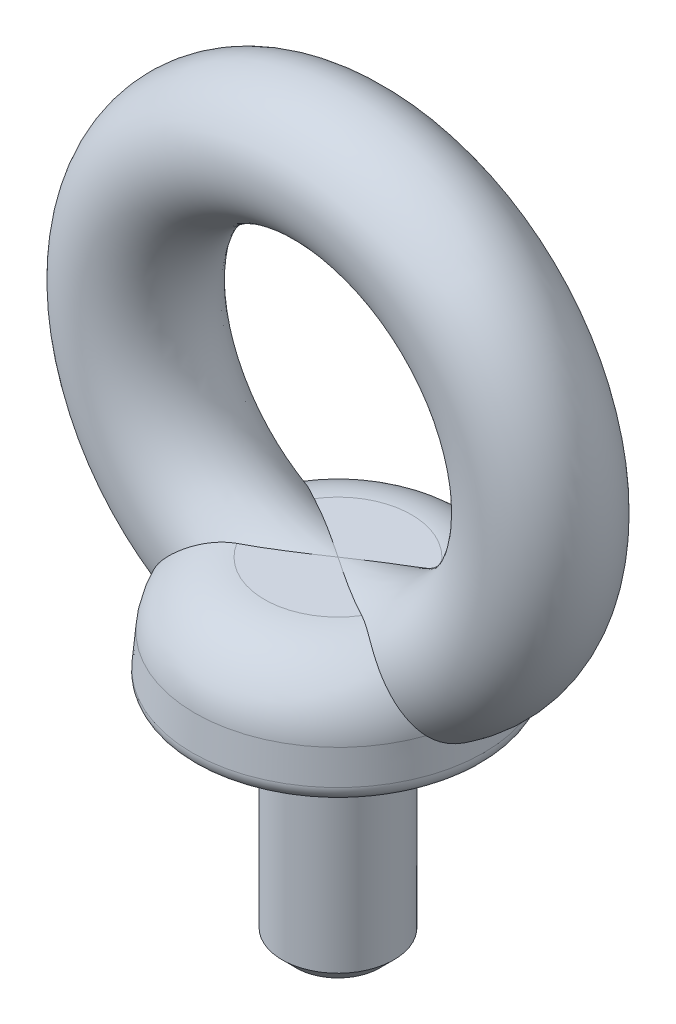
ISO-10303-21;
HEADER;
FILE_DESCRIPTION(('STEP AP214'),'2;1');
FILE_NAME('part.step','',(''),(''),'','','');
FILE_SCHEMA(('AUTOMOTIVE_DESIGN { 1 0 10303 214 1 1 1 1 }'));
ENDSEC;
DATA;
#1=APPLICATION_CONTEXT('core data for automotive mechanical design processes');
#2=APPLICATION_PROTOCOL_DEFINITION('international standard','automotive_design',2000,#1);
#3=PRODUCT_CONTEXT('',#1,'mechanical');
#4=PRODUCT('Part','Part','',(#3));
#5=PRODUCT_RELATED_PRODUCT_CATEGORY('part','',(#4));
#6=PRODUCT_DEFINITION_FORMATION('','',#4);
#7=PRODUCT_DEFINITION_CONTEXT('part definition',#1,'design');
#8=PRODUCT_DEFINITION('design','',#6,#7);
#9=PRODUCT_DEFINITION_SHAPE('','',#8);
#10=(LENGTH_UNIT() NAMED_UNIT(*) SI_UNIT(.MILLI.,.METRE.));
#11=(NAMED_UNIT(*) PLANE_ANGLE_UNIT() SI_UNIT($,.RADIAN.));
#12=(NAMED_UNIT(*) SI_UNIT($,.STERADIAN.) SOLID_ANGLE_UNIT());
#13=UNCERTAINTY_MEASURE_WITH_UNIT(LENGTH_MEASURE(1.E-05),#10,'distance_accuracy_value','');
#14=(GEOMETRIC_REPRESENTATION_CONTEXT(3) GLOBAL_UNCERTAINTY_ASSIGNED_CONTEXT((#13)) GLOBAL_UNIT_ASSIGNED_CONTEXT((#10,
#11,#12)) REPRESENTATION_CONTEXT('',''));
#15=CARTESIAN_POINT('',(0.,0.,0.));
#16=DIRECTION('',(0.,0.,1.));
#17=DIRECTION('',(1.,0.,0.));
#18=AXIS2_PLACEMENT_3D('',#15,#16,#17);
#19=CARTESIAN_POINT('',(0.,0.,0.));
#20=DIRECTION('',(0.,1.,0.));
#21=DIRECTION('',(0.,0.,1.));
#22=AXIS2_PLACEMENT_3D('',#19,#20,#21);
#23=PLANE('',#22);
#24=CARTESIAN_POINT('',(0.,0.,0.));
#25=DIRECTION('',(0.,1.,0.));
#26=DIRECTION('',(0.,0.,1.));
#27=AXIS2_PLACEMENT_3D('',#24,#25,#26);
#28=CIRCLE('',#27,2.36467287473268);
#29=CARTESIAN_POINT('',(0.,0.,2.36467287473268));
#30=VERTEX_POINT('',#29);
#31=EDGE_CURVE('E188',#30,#30,#28,.F.);
#32=ORIENTED_EDGE('',*,*,#31,.T.);
#33=EDGE_LOOP('',(#32));
#34=FACE_BOUND('',#33,.T.);
#35=CARTESIAN_POINT('',(0.,0.,0.));
#36=DIRECTION('',(0.,1.,0.));
#37=DIRECTION('',(0.,0.,1.));
#38=AXIS2_PLACEMENT_3D('',#35,#36,#37);
#39=CIRCLE('',#38,1.);
#40=CARTESIAN_POINT('',(0.,0.,1.));
#41=VERTEX_POINT('',#40);
#42=EDGE_CURVE('E191',#41,#41,#39,.T.);
#43=ORIENTED_EDGE('',*,*,#42,.T.);
#44=EDGE_LOOP('',(#43));
#45=FACE_BOUND('',#44,.T.);
#46=ADVANCED_FACE('F39',(#34,#45),#23,.F.);
#47=CARTESIAN_POINT('',(0.,2.,0.));
#48=DIRECTION('',(0.,1.,0.));
#49=DIRECTION('',(0.,0.,1.));
#50=AXIS2_PLACEMENT_3D('',#47,#48,#49);
#51=PLANE('',#50);
#52=CARTESIAN_POINT('',(0.,2.,0.));
#53=CARTESIAN_POINT('',(-0.00138409122770579,2.,-0.000928476146925711));
#54=CARTESIAN_POINT('',(-0.0027681825606933,2.,-0.00185695284612975));
#55=CARTESIAN_POINT('',(-0.162615317010321,2.00000000000003,-0.10908536698182));
#56=CARTESIAN_POINT('',(-0.321098427042225,2.00000000000001,-0.215364236272865));
#57=CARTESIAN_POINT('',(-0.642556318670196,1.99999999999999,-0.421508242799578));
#58=CARTESIAN_POINT('',(-0.805535735588401,2.,-0.52136637857884));
#59=CARTESIAN_POINT('',(-1.13738109759114,2.,-0.705971695960755));
#60=CARTESIAN_POINT('',(-1.30614701866206,2.,-0.790893395826265));
#61=CARTESIAN_POINT('',(-1.65313868543101,2.,-0.938041353631445));
#62=CARTESIAN_POINT('',(-1.83132829037376,2.,-1.00034800389567));
#63=CARTESIAN_POINT('',(-2.13036137927402,2.,-1.07473182884484));
#64=CARTESIAN_POINT('',(-2.24862768187056,2.,-1.09682614354295));
#65=CARTESIAN_POINT('',(-2.42857338989204,2.,-1.11707090413544));
#66=CARTESIAN_POINT('',(-2.48953666427238,2.,-1.12165083664664));
#67=CARTESIAN_POINT('',(-2.61172683939246,2.,-1.12580496779447));
#68=CARTESIAN_POINT('',(-2.6729540085122,2.,-1.12537094474276));
#69=CARTESIAN_POINT('',(-2.7340934574525,2.,-1.1221688392154));
#70=B_SPLINE_CURVE_WITH_KNOTS('',3,(#52,#53,#54,#55,#56,#57,#58,#59,#60,#61,#62,#63,#64,#65,#66,
#67,#68,#69),.UNSPECIFIED.,.F.,.F.,(4,2,2,2,2,2,2,2,4),(0.,0.00500000000000066,
0.577443676661357,1.15050134060949,1.71633967382284,2.28014638692955,2.6399668541472,
2.82318474846742,3.00670311891554),.UNSPECIFIED.);
#71=CARTESIAN_POINT('',(0.,2.,0.));
#72=VERTEX_POINT('',#71);
#73=CARTESIAN_POINT('',(-1.11966575300488,2.,-0.693630985076324));
#74=VERTEX_POINT('',#73);
#75=EDGE_CURVE('E54',#72,#74,#70,.T.);
#76=ORIENTED_EDGE('',*,*,#75,.F.);
#77=CARTESIAN_POINT('',(0.,2.,0.));
#78=CARTESIAN_POINT('',(0.00138409122770579,2.,-0.000928476146925711));
#79=CARTESIAN_POINT('',(0.0027681825606933,2.,-0.00185695284612975));
#80=CARTESIAN_POINT('',(0.162615317010321,2.00000000000003,-0.10908536698182));
#81=CARTESIAN_POINT('',(0.321098427042225,2.00000000000001,-0.215364236272865));
#82=CARTESIAN_POINT('',(0.642556318670196,1.99999999999999,-0.421508242799578));
#83=CARTESIAN_POINT('',(0.805535735588401,2.,-0.52136637857884));
#84=CARTESIAN_POINT('',(1.13738109759114,2.,-0.705971695960755));
#85=CARTESIAN_POINT('',(1.30614701866206,2.,-0.790893395826265));
#86=CARTESIAN_POINT('',(1.65313868543101,2.,-0.938041353631445));
#87=CARTESIAN_POINT('',(1.83132829037376,2.,-1.00034800389567));
#88=CARTESIAN_POINT('',(2.13036137927402,2.,-1.07473182884484));
#89=CARTESIAN_POINT('',(2.24862768187056,2.,-1.09682614354295));
#90=CARTESIAN_POINT('',(2.42857338989204,2.,-1.11707090413544));
#91=CARTESIAN_POINT('',(2.48953666427238,2.,-1.12165083664664));
#92=CARTESIAN_POINT('',(2.61172683939246,2.,-1.12580496779447));
#93=CARTESIAN_POINT('',(2.6729540085122,2.,-1.12537094474276));
#94=CARTESIAN_POINT('',(2.7340934574525,2.,-1.1221688392154));
#95=B_SPLINE_CURVE_WITH_KNOTS('',3,(#77,#78,#79,#80,#81,#82,#83,#84,#85,#86,#87,#88,#89,#90,#91,
#92,#93,#94),.UNSPECIFIED.,.F.,.F.,(4,2,2,2,2,2,2,2,4),(0.,0.00500000000000066,
0.577443676661357,1.15050134060949,1.71633967382284,2.28014638692955,2.6399668541472,
2.82318474846742,3.00670311891554),.UNSPECIFIED.);
#96=CARTESIAN_POINT('',(1.11966575300489,2.,-0.693630985076301));
#97=VERTEX_POINT('',#96);
#98=EDGE_CURVE('E102',#97,#72,#95,.F.);
#99=ORIENTED_EDGE('',*,*,#98,.F.);
#100=CARTESIAN_POINT('',(0.,2.,0.));
#101=DIRECTION('',(0.,1.,0.));
#102=DIRECTION('',(0.,0.,1.));
#103=AXIS2_PLACEMENT_3D('',#100,#101,#102);
#104=CIRCLE('',#103,1.31710870542637);
#105=EDGE_CURVE('E318',#97,#74,#104,.T.);
#106=ORIENTED_EDGE('',*,*,#105,.T.);
#107=EDGE_LOOP('',(#76,#99,#106));
#108=FACE_BOUND('',#107,.T.);
#109=ADVANCED_FACE('F180',(#108),#51,.T.);
#110=CARTESIAN_POINT('',(0.,0.75,0.));
#111=DIRECTION('',(0.,1.,0.));
#112=DIRECTION('',(0.,0.,1.));
#113=AXIS2_PLACEMENT_3D('',#110,#111,#112);
#114=TOROIDAL_SURFACE('',#113,1.31710870542637,1.25);
#115=CARTESIAN_POINT('',(2.42039796914941,0.858894678434573,-0.841037606347116));
#116=CARTESIAN_POINT('',(2.41150547808007,0.879981984721991,-0.861011370284895));
#117=CARTESIAN_POINT('',(2.40200403891799,0.901642037124406,-0.880090939790039));
#118=CARTESIAN_POINT('',(2.38174136886284,0.945944322718926,-0.916357850156611));
#119=CARTESIAN_POINT('',(2.37097983503115,0.968586791266183,-0.933544734063541));
#120=CARTESIAN_POINT('',(2.33673266722838,1.0377601523188,-0.982119959579194));
#121=CARTESIAN_POINT('',(2.31129713982183,1.08550619080916,-1.01049383691973));
#122=CARTESIAN_POINT('',(2.25525140209412,1.18255505391846,-1.05830108235167));
#123=CARTESIAN_POINT('',(2.22463086526007,1.23186082235517,-1.07771631511264));
#124=CARTESIAN_POINT('',(2.15860473404437,1.33006497499959,-1.10687997831171));
#125=CARTESIAN_POINT('',(2.12320511505156,1.37896378824822,-1.11664035551223));
#126=CARTESIAN_POINT('',(2.04970080845279,1.47256424566783,-1.12608467484591));
#127=CARTESIAN_POINT('',(2.01175922447572,1.51735544391369,-1.12615313231805));
#128=CARTESIAN_POINT('',(1.93271591031358,1.60313949237734,-1.11742114519198));
#129=CARTESIAN_POINT('',(1.89161352963342,1.64413155688122,-1.10861887045206));
#130=CARTESIAN_POINT('',(1.8079643196868,1.71994439074484,-1.08321423460844));
#131=CARTESIAN_POINT('',(1.76546789486288,1.75487937256813,-1.06678453233506));
#132=CARTESIAN_POINT('',(1.67887427645391,1.81848931902083,-1.02746329945967));
#133=CARTESIAN_POINT('',(1.63477767290606,1.84716656426527,-1.00457412999074));
#134=CARTESIAN_POINT('',(1.54264253220054,1.89902087157686,-0.952520238273537));
#135=CARTESIAN_POINT('',(1.49452684988591,1.92176061115668,-0.923059783325188));
#136=CARTESIAN_POINT('',(1.3967286641391,1.95885359907775,-0.861312588732647));
#137=CARTESIAN_POINT('',(1.34704241240058,1.97318488989702,-0.829018700239076));
#138=CARTESIAN_POINT('',(1.25075798911749,1.99206720619931,-0.76838493020841));
#139=CARTESIAN_POINT('',(1.20436882183495,1.99747351542922,-0.739980374857328));
#140=CARTESIAN_POINT('',(1.10929155781928,2.00110585166331,-0.687307941097035));
#141=CARTESIAN_POINT('',(1.06062099431507,1.99937986063686,-0.663013560335142));
#142=CARTESIAN_POINT('',(0.968596883629371,1.99001955811812,-0.626098684318004));
#143=CARTESIAN_POINT('',(0.925664935838794,1.98339117664191,-0.612222559613753));
#144=CARTESIAN_POINT('',(0.86039016732774,1.97071539983241,-0.59711669625961));
#145=CARTESIAN_POINT('',(0.838411430092534,1.96601442968154,-0.593028833236067));
#146=CARTESIAN_POINT('',(0.794366125123625,1.95593080847073,-0.586725364893368));
#147=CARTESIAN_POINT('',(0.772299661153692,1.95054881185459,-0.58450797758792));
#148=CARTESIAN_POINT('',(0.719154501602297,1.93704091889652,-0.58118935598795));
#149=CARTESIAN_POINT('',(0.688083723835251,1.92869355431696,-0.580916404100505));
#150=CARTESIAN_POINT('',(0.626076861097626,1.9117293086771,-0.582788802681816));
#151=CARTESIAN_POINT('',(0.595141017505899,1.90311207569429,-0.584937450578257));
#152=CARTESIAN_POINT('',(0.533144324526091,1.88608734843549,-0.590675490691851));
#153=CARTESIAN_POINT('',(0.502083928174988,1.8776815327694,-0.59427394189973));
#154=CARTESIAN_POINT('',(0.439861378293333,1.86159673569978,-0.60202559071365));
#155=CARTESIAN_POINT('',(0.408699278636015,1.85391741901609,-0.606178530267754));
#156=CARTESIAN_POINT('',(0.346471938992451,1.83978801638737,-0.614271855394327));
#157=CARTESIAN_POINT('',(0.315410196641867,1.83332401240693,-0.618214222865114));
#158=CARTESIAN_POINT('',(0.252933286434531,1.8218954905164,-0.625389345239395));
#159=CARTESIAN_POINT('',(0.221518253780048,1.81693041795681,-0.628622362502412));
#160=CARTESIAN_POINT('',(0.158548314164443,1.80885956460285,-0.633949322318588));
#161=CARTESIAN_POINT('',(0.12699554347192,1.80574223986466,-0.636050329515921));
#162=CARTESIAN_POINT('',(0.0636919061812754,1.80155463382932,-0.63888353697977));
#163=CARTESIAN_POINT('',(0.0319410693356876,1.80048405217148,-0.639615938089639));
#164=CARTESIAN_POINT('',(-0.0307178516850954,1.80047546423124,-0.639621782100821));
#165=CARTESIAN_POINT('',(-0.0616259454764916,1.80148163159415,-0.638933417481909));
#166=CARTESIAN_POINT('',(-0.123259668362024,1.80543711629179,-0.6362563278));
#167=CARTESIAN_POINT('',(-0.153985276893146,1.80838664857117,-0.634267458895744));
#168=CARTESIAN_POINT('',(-0.215301950880578,1.81603914162037,-0.629205449850562));
#169=CARTESIAN_POINT('',(-0.245891175127802,1.82075226813661,-0.626126029151428));
#170=CARTESIAN_POINT('',(-0.306737126087516,1.83162541649934,-0.619266566540589));
#171=CARTESIAN_POINT('',(-0.33699373759345,1.83778592410954,-0.61548628950057));
#172=CARTESIAN_POINT('',(-0.428204898309679,1.8581083189365,-0.603667142824017));
#173=CARTESIAN_POINT('',(-0.48870198982746,1.87397933951536,-0.595249863543692));
#174=CARTESIAN_POINT('',(-0.609630407138156,1.90701613658001,-0.58324566142176));
#175=CARTESIAN_POINT('',(-0.670059841651902,1.92417333338502,-0.579629297436111));
#176=CARTESIAN_POINT('',(-0.774142499657668,1.95119852576556,-0.583912273461106));
#177=CARTESIAN_POINT('',(-0.81766645960905,1.96175005385817,-0.588822252272903));
#178=CARTESIAN_POINT('',(-0.903612265037172,1.97950121179433,-0.606177451139279));
#179=CARTESIAN_POINT('',(-0.946039542332458,1.98672283462284,-0.618571943538506));
#180=CARTESIAN_POINT('',(-1.02892867288492,1.99672112208587,-0.649422404719276));
#181=CARTESIAN_POINT('',(-1.06939684890633,1.99951315956102,-0.667857140871685));
#182=CARTESIAN_POINT('',(-1.14871437226766,2.00037343312812,-0.708435636176288));
#183=CARTESIAN_POINT('',(-1.18755255309529,1.99841323339055,-0.730600980323087));
#184=CARTESIAN_POINT('',(-1.25542737944985,1.99067281071267,-0.771376997109682));
#185=CARTESIAN_POINT('',(-1.28474930196113,1.98582223840216,-0.789704316301775));
#186=CARTESIAN_POINT('',(-1.34271384957444,1.97325106497408,-0.8264563551847));
#187=CARTESIAN_POINT('',(-1.37135621169787,1.96552937144779,-0.844881109313995));
#188=CARTESIAN_POINT('',(-1.45642105854802,1.93814049749805,-0.899221931174776));
#189=CARTESIAN_POINT('',(-1.51210059844485,1.91423545207616,-0.934282834596374));
#190=CARTESIAN_POINT('',(-1.62188928203517,1.85571081470426,-0.99793326709202));
#191=CARTESIAN_POINT('',(-1.67599135292653,1.8210492680532,-1.02649668385246));
#192=CARTESIAN_POINT('',(-1.78173215288799,1.74243068059502,-1.07378186603908));
#193=CARTESIAN_POINT('',(-1.83337249856053,1.69847984601635,-1.09251017339328));
#194=CARTESIAN_POINT('',(-1.92671099911643,1.60945259035115,-1.1163970370076));
#195=CARTESIAN_POINT('',(-1.96884479421639,1.565204631705,-1.12295993942017));
#196=CARTESIAN_POINT('',(-2.04938632154604,1.47312235238822,-1.1262243095909));
#197=CARTESIAN_POINT('',(-2.08779594195042,1.42528987112897,-1.1229308018743));
#198=CARTESIAN_POINT('',(-2.15776889516972,1.33117782285486,-1.10694709307882));
#199=CARTESIAN_POINT('',(-2.18961508486601,1.2849997337084,-1.09488227622439));
#200=CARTESIAN_POINT('',(-2.24898462403084,1.192772743093,-1.06239164711726));
#201=CARTESIAN_POINT('',(-2.27650557337996,1.14672392718032,-1.04196121521108));
#202=CARTESIAN_POINT('',(-2.32557145608986,1.05880834073601,-0.994687257760194));
#203=CARTESIAN_POINT('',(-2.34736379327855,1.01685147129592,-0.968264097530917));
#204=CARTESIAN_POINT('',(-2.3868931810764,0.935609849491477,-0.909172956923643));
#205=CARTESIAN_POINT('',(-2.40463628897125,0.896321168429512,-0.876514440301434));
#206=CARTESIAN_POINT('',(-2.42039796914941,0.858894678434573,-0.841037606347116));
#207=B_SPLINE_CURVE_WITH_KNOTS('',3,(#115,#116,#117,#118,#119,#120,#121,#122,#123,#124,#125,
#126,#127,#128,#129,#130,#131,#132,#133,#134,#135,#136,#137,#138,#139,#140,#141,#142,#143,#144,
#145,#146,#147,#148,#149,#150,#151,#152,#153,#154,#155,#156,#157,#158,#159,#160,#161,#162,#163,
#164,#165,#166,#167,#168,#169,#170,#171,#172,#173,#174,#175,#176,#177,#178,#179,#180,#181,#182,
#183,#184,#185,#186,#187,#188,#189,#190,#191,#192,#193,#194,#195,#196,#197,#198,#199,#200,#201,
#202,#203,#204,#205,#206),.UNSPECIFIED.,.F.,.F.,(4,2,2,2,2,2,2,2,2,2,2,2,2,2,2,2,2,2,2,2,2,2,2,
2,2,2,2,2,2,2,2,2,2,2,2,2,2,2,2,2,2,2,2,2,2,4),(0.,0.0910778204772509,0.182177582050658,
0.364508082964014,0.547206080517173,0.729677726665729,0.904907914448632,1.0801742617879,
1.25165335250602,1.42306984337288,1.60484930129675,1.78710136281552,1.95058260755247,
2.11296584224318,2.24895550133768,2.31740573150132,2.38579067582663,2.48216487489149,
2.57867046284526,2.6757886498414,2.77286179577286,2.86874464530231,2.96459197169655,
3.05983399450629,3.15506203942266,3.2477635627752,3.34047534104202,3.43372997565794,
3.52701595280746,3.71631888575356,3.90445549047077,4.03895078045763,4.17254457811951,
4.30567371733238,4.43960142171921,4.54422608656328,4.64889059996759,4.85779476702523,
5.06752420915918,5.27711397025018,5.4604871547657,5.64376687663003,5.81512065544842,
5.98656918700592,6.14847255832901,6.31013212549879),.UNSPECIFIED.);
#208=CARTESIAN_POINT('',(2.42037688183329,0.858944678434573,-0.841084967008846));
#209=VERTEX_POINT('',#208);
#210=EDGE_CURVE('E198',#209,#97,#207,.T.);
#211=ORIENTED_EDGE('',*,*,#210,.F.);
#212=CARTESIAN_POINT('',(0.,0.858944678434573,0.));
#213=DIRECTION('',(0.,-1.,0.));
#214=DIRECTION('',(0.,0.,-1.));
#215=AXIS2_PLACEMENT_3D('',#212,#213,#214);
#216=CIRCLE('',#215,2.56235207804105);
#217=CARTESIAN_POINT('',(-2.42037688183329,0.858944678434573,-0.841084967008852));
#218=VERTEX_POINT('',#217);
#219=EDGE_CURVE('E94',#218,#209,#216,.T.);
#220=ORIENTED_EDGE('',*,*,#219,.F.);
#221=EDGE_CURVE('E62',#74,#218,#207,.T.);
#222=ORIENTED_EDGE('',*,*,#221,.F.);
#223=ORIENTED_EDGE('',*,*,#105,.F.);
#224=EDGE_LOOP('',(#211,#220,#222,#223));
#225=FACE_BOUND('',#224,.T.);
#226=ADVANCED_FACE('F176',(#225),#114,.T.);
#227=CARTESIAN_POINT('',(0.,0.,0.));
#228=DIRECTION('',(0.,-1.,0.));
#229=DIRECTION('',(0.,0.,1.));
#230=AXIS2_PLACEMENT_3D('',#227,#228,#229);
#231=CONICAL_SURFACE('',#230,2.6375,0.0872664625997167);
#232=CARTESIAN_POINT('',(0.,0.271788935686915,0.));
#233=DIRECTION('',(0.,1.,0.));
#234=DIRECTION('',(0.,0.,1.));
#235=AXIS2_PLACEMENT_3D('',#232,#233,#234);
#236=CIRCLE('',#235,2.61372154925562);
#237=CARTESIAN_POINT('',(0.,0.271788935686915,2.61372154925562));
#238=VERTEX_POINT('',#237);
#239=EDGE_CURVE('E193',#238,#238,#236,.T.);
#240=ORIENTED_EDGE('',*,*,#239,.T.);
#241=EDGE_LOOP('',(#240));
#242=FACE_BOUND('',#241,.T.);
#243=ORIENTED_EDGE('',*,*,#219,.T.);
#244=CARTESIAN_POINT('',(2.42035579443862,0.858994678434573,-0.841132321642643));
#245=CARTESIAN_POINT('',(2.4294473701614,0.837437586742842,-0.820718903782232));
#246=CARTESIAN_POINT('',(2.4384842821547,0.816811026126293,-0.79932478618977));
#247=CARTESIAN_POINT('',(2.45625491337731,0.77749127371143,-0.754721284129707));
#248=CARTESIAN_POINT('',(2.46498870495199,0.758797618451395,-0.731512337167105));
#249=CARTESIAN_POINT('',(2.49040907887093,0.705797604620924,-0.65948657046904));
#250=CARTESIAN_POINT('',(2.50636180212683,0.674464282109409,-0.608167821937932));
#251=CARTESIAN_POINT('',(2.53490778233552,0.620246861141422,-0.500449004857166));
#252=CARTESIAN_POINT('',(2.54750178283466,0.597360892197639,-0.444050064653233));
#253=CARTESIAN_POINT('',(2.56833834681167,0.560229257880268,-0.327700956606311));
#254=CARTESIAN_POINT('',(2.57658025011028,0.545984903323517,-0.267750251521408));
#255=CARTESIAN_POINT('',(2.58815122716632,0.526129821155292,-0.14505107159549));
#256=CARTESIAN_POINT('',(2.59140549090385,0.520650509034008,-0.0822742630633493));
#257=CARTESIAN_POINT('',(2.59251073885308,0.518780950988376,0.0434608977006726));
#258=CARTESIAN_POINT('',(2.59036167277241,0.522390789662782,0.106419251616869));
#259=CARTESIAN_POINT('',(2.58080337250124,0.538712026271973,0.231059286705049));
#260=CARTESIAN_POINT('',(2.57336831313432,0.551468111600703,0.292733163676111));
#261=CARTESIAN_POINT('',(2.55381274525936,0.58600354845099,0.412710185896341));
#262=CARTESIAN_POINT('',(2.54169205612608,0.60778324782406,0.471013201103334));
#263=CARTESIAN_POINT('',(2.51287185541721,0.661829402496966,0.586105183964587));
#264=CARTESIAN_POINT('',(2.49593304296936,0.69466739671356,0.642570422391216));
#265=CARTESIAN_POINT('',(2.46865582176811,0.751020163471779,0.721560186838688));
#266=CARTESIAN_POINT('',(2.45923457970678,0.7710264919696,0.746976471387586));
#267=CARTESIAN_POINT('',(2.44001597902583,0.813320756402439,0.795690473130165));
#268=CARTESIAN_POINT('',(2.43021852856796,0.835609251691149,0.818987668285181));
#269=CARTESIAN_POINT('',(2.42035579443862,0.858994678434573,0.841132321642643));
#270=B_SPLINE_CURVE_WITH_KNOTS('',3,(#244,#245,#246,#247,#248,#249,#250,#251,#252,#253,#254,
#255,#256,#257,#258,#259,#260,#261,#262,#263,#264,#265,#266,#267,#268,#269),.UNSPECIFIED.,.F.,
.F.,(4,2,2,2,2,2,2,2,2,2,2,2,4),(0.,0.0930863137574845,0.1861502557641,0.371814931559176,
0.557438471150921,0.743090160305041,0.931500108006125,1.11991180937,1.3092503945466,
1.49859627922005,1.69980540281061,1.80074826705875,1.90171593165768),.UNSPECIFIED.);
#271=CARTESIAN_POINT('',(2.42037688183329,0.858944678434544,0.841084967008853));
#272=VERTEX_POINT('',#271);
#273=EDGE_CURVE('E98',#209,#272,#270,.T.);
#274=ORIENTED_EDGE('',*,*,#273,.T.);
#275=CARTESIAN_POINT('',(-2.42037688183329,0.858944678434573,0.841084967008846));
#276=VERTEX_POINT('',#275);
#277=EDGE_CURVE('E84',#272,#276,#216,.T.);
#278=ORIENTED_EDGE('',*,*,#277,.T.);
#279=CARTESIAN_POINT('',(-2.42035579443862,0.858994678434573,0.841132321642643));
#280=CARTESIAN_POINT('',(-2.4294473701614,0.837437586742842,0.820718903782232));
#281=CARTESIAN_POINT('',(-2.4384842821547,0.816811026126293,0.79932478618977));
#282=CARTESIAN_POINT('',(-2.45625491337731,0.77749127371143,0.754721284129707));
#283=CARTESIAN_POINT('',(-2.46498870495199,0.758797618451395,0.731512337167105));
#284=CARTESIAN_POINT('',(-2.49040907887093,0.705797604620924,0.65948657046904));
#285=CARTESIAN_POINT('',(-2.50636180212683,0.674464282109409,0.608167821937932));
#286=CARTESIAN_POINT('',(-2.53490778233552,0.620246861141422,0.500449004857166));
#287=CARTESIAN_POINT('',(-2.54750178283466,0.597360892197639,0.444050064653233));
#288=CARTESIAN_POINT('',(-2.56833834681167,0.560229257880268,0.327700956606311));
#289=CARTESIAN_POINT('',(-2.57658025011028,0.545984903323517,0.267750251521408));
#290=CARTESIAN_POINT('',(-2.58815122716632,0.526129821155292,0.14505107159549));
#291=CARTESIAN_POINT('',(-2.59140549090385,0.520650509034008,0.0822742630633493));
#292=CARTESIAN_POINT('',(-2.59251073885308,0.518780950988376,-0.0434608977006726));
#293=CARTESIAN_POINT('',(-2.59036167277241,0.522390789662782,-0.106419251616869));
#294=CARTESIAN_POINT('',(-2.58080337250124,0.538712026271973,-0.231059286705049));
#295=CARTESIAN_POINT('',(-2.57336831313432,0.551468111600703,-0.292733163676111));
#296=CARTESIAN_POINT('',(-2.55381274525936,0.58600354845099,-0.412710185896341));
#297=CARTESIAN_POINT('',(-2.54169205612608,0.60778324782406,-0.471013201103334));
#298=CARTESIAN_POINT('',(-2.51287185541721,0.661829402496966,-0.586105183964587));
#299=CARTESIAN_POINT('',(-2.49593304296936,0.69466739671356,-0.642570422391216));
#300=CARTESIAN_POINT('',(-2.46865582176811,0.751020163471779,-0.721560186838688));
#301=CARTESIAN_POINT('',(-2.45923457970678,0.7710264919696,-0.746976471387586));
#302=CARTESIAN_POINT('',(-2.44001597902583,0.813320756402439,-0.795690473130165));
#303=CARTESIAN_POINT('',(-2.43021852856796,0.835609251691149,-0.818987668285181));
#304=CARTESIAN_POINT('',(-2.42035579443862,0.858994678434573,-0.841132321642643));
#305=B_SPLINE_CURVE_WITH_KNOTS('',3,(#279,#280,#281,#282,#283,#284,#285,#286,#287,#288,#289,
#290,#291,#292,#293,#294,#295,#296,#297,#298,#299,#300,#301,#302,#303,#304),.UNSPECIFIED.,.F.,
.F.,(4,2,2,2,2,2,2,2,2,2,2,2,4),(0.,0.0930863137574845,0.1861502557641,0.371814931559176,
0.557438471150921,0.743090160305041,0.931500108006125,1.11991180937,1.3092503945466,
1.49859627922005,1.69980540281061,1.80074826705875,1.90171593165768),.UNSPECIFIED.);
#306=EDGE_CURVE('E165',#276,#218,#305,.T.);
#307=ORIENTED_EDGE('',*,*,#306,.T.);
#308=EDGE_LOOP('',(#243,#274,#278,#307));
#309=FACE_BOUND('',#308,.T.);
#310=ADVANCED_FACE('F99',(#242,#309),#231,.T.);
#311=CARTESIAN_POINT('',(0.,2.,0.));
#312=CARTESIAN_POINT('',(0.00138409122770579,2.,0.000928476146925711));
#313=CARTESIAN_POINT('',(0.0027681825606933,2.,0.00185695284612975));
#314=CARTESIAN_POINT('',(0.162615317010321,2.00000000000003,0.10908536698182));
#315=CARTESIAN_POINT('',(0.321098427042225,2.00000000000001,0.215364236272865));
#316=CARTESIAN_POINT('',(0.642556318670196,1.99999999999999,0.421508242799578));
#317=CARTESIAN_POINT('',(0.805535735588401,2.,0.52136637857884));
#318=CARTESIAN_POINT('',(1.13738109759114,2.,0.705971695960755));
#319=CARTESIAN_POINT('',(1.30614701866206,2.,0.790893395826265));
#320=CARTESIAN_POINT('',(1.65313868543101,2.,0.938041353631445));
#321=CARTESIAN_POINT('',(1.83132829037376,2.,1.00034800389567));
#322=CARTESIAN_POINT('',(2.13036137927402,2.,1.07473182884484));
#323=CARTESIAN_POINT('',(2.24862768187056,2.,1.09682614354295));
#324=CARTESIAN_POINT('',(2.42857338989204,2.,1.11707090413544));
#325=CARTESIAN_POINT('',(2.48953666427238,2.,1.12165083664664));
#326=CARTESIAN_POINT('',(2.61172683939246,2.,1.12580496779447));
#327=CARTESIAN_POINT('',(2.6729540085122,2.,1.12537094474276));
#328=CARTESIAN_POINT('',(2.7340934574525,2.,1.1221688392154));
#329=B_SPLINE_CURVE_WITH_KNOTS('',3,(#311,#312,#313,#314,#315,#316,#317,#318,#319,#320,#321,
#322,#323,#324,#325,#326,#327,#328),.UNSPECIFIED.,.F.,.F.,(4,2,2,2,2,2,2,2,4),(0.,
0.00500000000000066,0.577443676661357,1.15050134060949,1.71633967382284,2.28014638692955,
2.6399668541472,2.82318474846742,3.00670311891554),.UNSPECIFIED.);
#330=CARTESIAN_POINT('',(1.11966575300488,2.,0.693630985076324));
#331=VERTEX_POINT('',#330);
#332=EDGE_CURVE('E103',#72,#331,#329,.T.);
#333=ORIENTED_EDGE('',*,*,#332,.F.);
#334=CARTESIAN_POINT('',(0.,2.,0.));
#335=CARTESIAN_POINT('',(-0.00138409122770579,2.,0.000928476146925711));
#336=CARTESIAN_POINT('',(-0.0027681825606933,2.,0.00185695284612975));
#337=CARTESIAN_POINT('',(-0.162615317010321,2.00000000000003,0.10908536698182));
#338=CARTESIAN_POINT('',(-0.321098427042225,2.00000000000001,0.215364236272865));
#339=CARTESIAN_POINT('',(-0.642556318670196,1.99999999999999,0.421508242799578));
#340=CARTESIAN_POINT('',(-0.805535735588401,2.,0.52136637857884));
#341=CARTESIAN_POINT('',(-1.13738109759114,2.,0.705971695960755));
#342=CARTESIAN_POINT('',(-1.30614701866206,2.,0.790893395826265));
#343=CARTESIAN_POINT('',(-1.65313868543101,2.,0.938041353631445));
#344=CARTESIAN_POINT('',(-1.83132829037376,2.,1.00034800389567));
#345=CARTESIAN_POINT('',(-2.13036137927402,2.,1.07473182884484));
#346=CARTESIAN_POINT('',(-2.24862768187056,2.,1.09682614354295));
#347=CARTESIAN_POINT('',(-2.42857338989204,2.,1.11707090413544));
#348=CARTESIAN_POINT('',(-2.48953666427238,2.,1.12165083664664));
#349=CARTESIAN_POINT('',(-2.61172683939246,2.,1.12580496779447));
#350=CARTESIAN_POINT('',(-2.6729540085122,2.,1.12537094474276));
#351=CARTESIAN_POINT('',(-2.7340934574525,2.,1.1221688392154));
#352=B_SPLINE_CURVE_WITH_KNOTS('',3,(#334,#335,#336,#337,#338,#339,#340,#341,#342,#343,#344,
#345,#346,#347,#348,#349,#350,#351),.UNSPECIFIED.,.F.,.F.,(4,2,2,2,2,2,2,2,4),(0.,
0.00500000000000066,0.577443676661357,1.15050134060949,1.71633967382284,2.28014638692955,
2.6399668541472,2.82318474846742,3.00670311891554),.UNSPECIFIED.);
#353=CARTESIAN_POINT('',(-1.11966575300489,2.,0.693630985076299));
#354=VERTEX_POINT('',#353);
#355=EDGE_CURVE('E159',#354,#72,#352,.F.);
#356=ORIENTED_EDGE('',*,*,#355,.F.);
#357=EDGE_CURVE('E321',#354,#331,#104,.T.);
#358=ORIENTED_EDGE('',*,*,#357,.T.);
#359=EDGE_LOOP('',(#333,#356,#358));
#360=FACE_BOUND('',#359,.T.);
#361=ADVANCED_FACE('F132',(#360),#51,.T.);
#362=CARTESIAN_POINT('',(-2.42039796914941,0.858894678434573,0.841037606347116));
#363=CARTESIAN_POINT('',(-2.41150547808007,0.879981984721991,0.861011370284895));
#364=CARTESIAN_POINT('',(-2.40200403891799,0.901642037124406,0.880090939790039));
#365=CARTESIAN_POINT('',(-2.38174136886284,0.945944322718926,0.916357850156611));
#366=CARTESIAN_POINT('',(-2.37097983503115,0.968586791266183,0.933544734063541));
#367=CARTESIAN_POINT('',(-2.33673266722838,1.0377601523188,0.982119959579194));
#368=CARTESIAN_POINT('',(-2.31129713982183,1.08550619080916,1.01049383691973));
#369=CARTESIAN_POINT('',(-2.25525140209412,1.18255505391846,1.05830108235167));
#370=CARTESIAN_POINT('',(-2.22463086526007,1.23186082235517,1.07771631511264));
#371=CARTESIAN_POINT('',(-2.15860473404437,1.33006497499959,1.10687997831171));
#372=CARTESIAN_POINT('',(-2.12320511505156,1.37896378824822,1.11664035551223));
#373=CARTESIAN_POINT('',(-2.04970080845279,1.47256424566783,1.12608467484591));
#374=CARTESIAN_POINT('',(-2.01175922447572,1.51735544391369,1.12615313231805));
#375=CARTESIAN_POINT('',(-1.93271591031358,1.60313949237734,1.11742114519198));
#376=CARTESIAN_POINT('',(-1.89161352963342,1.64413155688122,1.10861887045206));
#377=CARTESIAN_POINT('',(-1.8079643196868,1.71994439074484,1.08321423460844));
#378=CARTESIAN_POINT('',(-1.76546789486288,1.75487937256813,1.06678453233506));
#379=CARTESIAN_POINT('',(-1.67887427645391,1.81848931902083,1.02746329945967));
#380=CARTESIAN_POINT('',(-1.63477767290606,1.84716656426527,1.00457412999074));
#381=CARTESIAN_POINT('',(-1.54264253220054,1.89902087157686,0.952520238273537));
#382=CARTESIAN_POINT('',(-1.49452684988591,1.92176061115668,0.923059783325188));
#383=CARTESIAN_POINT('',(-1.3967286641391,1.95885359907775,0.861312588732647));
#384=CARTESIAN_POINT('',(-1.34704241240058,1.97318488989702,0.829018700239076));
#385=CARTESIAN_POINT('',(-1.25075798911749,1.99206720619931,0.76838493020841));
#386=CARTESIAN_POINT('',(-1.20436882183495,1.99747351542922,0.739980374857328));
#387=CARTESIAN_POINT('',(-1.10929155781928,2.00110585166331,0.687307941097035));
#388=CARTESIAN_POINT('',(-1.06062099431507,1.99937986063686,0.663013560335142));
#389=CARTESIAN_POINT('',(-0.968596883629371,1.99001955811812,0.626098684318004));
#390=CARTESIAN_POINT('',(-0.925664935838794,1.98339117664191,0.612222559613753));
#391=CARTESIAN_POINT('',(-0.86039016732774,1.97071539983241,0.59711669625961));
#392=CARTESIAN_POINT('',(-0.838411430092534,1.96601442968154,0.593028833236067));
#393=CARTESIAN_POINT('',(-0.794366125123625,1.95593080847073,0.586725364893368));
#394=CARTESIAN_POINT('',(-0.772299661153692,1.95054881185459,0.58450797758792));
#395=CARTESIAN_POINT('',(-0.719154501602297,1.93704091889652,0.58118935598795));
#396=CARTESIAN_POINT('',(-0.688083723835251,1.92869355431696,0.580916404100505));
#397=CARTESIAN_POINT('',(-0.626076861097626,1.9117293086771,0.582788802681816));
#398=CARTESIAN_POINT('',(-0.595141017505899,1.90311207569429,0.584937450578257));
#399=CARTESIAN_POINT('',(-0.533144324526091,1.88608734843549,0.590675490691851));
#400=CARTESIAN_POINT('',(-0.502083928174988,1.8776815327694,0.59427394189973));
#401=CARTESIAN_POINT('',(-0.439861378293333,1.86159673569978,0.60202559071365));
#402=CARTESIAN_POINT('',(-0.408699278636015,1.85391741901609,0.606178530267754));
#403=CARTESIAN_POINT('',(-0.346471938992451,1.83978801638737,0.614271855394327));
#404=CARTESIAN_POINT('',(-0.315410196641867,1.83332401240693,0.618214222865114));
#405=CARTESIAN_POINT('',(-0.252933286434531,1.8218954905164,0.625389345239395));
#406=CARTESIAN_POINT('',(-0.221518253780048,1.81693041795681,0.628622362502412));
#407=CARTESIAN_POINT('',(-0.158548314164443,1.80885956460285,0.633949322318588));
#408=CARTESIAN_POINT('',(-0.12699554347192,1.80574223986466,0.636050329515921));
#409=CARTESIAN_POINT('',(-0.0636919061812754,1.80155463382932,0.63888353697977));
#410=CARTESIAN_POINT('',(-0.0319410693356876,1.80048405217148,0.639615938089639));
#411=CARTESIAN_POINT('',(0.0307178516850954,1.80047546423124,0.639621782100821));
#412=CARTESIAN_POINT('',(0.0616259454764916,1.80148163159415,0.638933417481909));
#413=CARTESIAN_POINT('',(0.123259668362024,1.80543711629179,0.6362563278));
#414=CARTESIAN_POINT('',(0.153985276893146,1.80838664857117,0.634267458895744));
#415=CARTESIAN_POINT('',(0.215301950880578,1.81603914162037,0.629205449850562));
#416=CARTESIAN_POINT('',(0.245891175127802,1.82075226813661,0.626126029151428));
#417=CARTESIAN_POINT('',(0.306737126087516,1.83162541649934,0.619266566540589));
#418=CARTESIAN_POINT('',(0.33699373759345,1.83778592410954,0.61548628950057));
#419=CARTESIAN_POINT('',(0.428204898309679,1.8581083189365,0.603667142824017));
#420=CARTESIAN_POINT('',(0.48870198982746,1.87397933951536,0.595249863543692));
#421=CARTESIAN_POINT('',(0.609630407138156,1.90701613658001,0.58324566142176));
#422=CARTESIAN_POINT('',(0.670059841651902,1.92417333338502,0.579629297436111));
#423=CARTESIAN_POINT('',(0.774142499657668,1.95119852576556,0.583912273461106));
#424=CARTESIAN_POINT('',(0.81766645960905,1.96175005385817,0.588822252272903));
#425=CARTESIAN_POINT('',(0.903612265037172,1.97950121179433,0.606177451139279));
#426=CARTESIAN_POINT('',(0.946039542332458,1.98672283462284,0.618571943538506));
#427=CARTESIAN_POINT('',(1.02892867288492,1.99672112208587,0.649422404719276));
#428=CARTESIAN_POINT('',(1.06939684890633,1.99951315956102,0.667857140871685));
#429=CARTESIAN_POINT('',(1.14871437226766,2.00037343312812,0.708435636176288));
#430=CARTESIAN_POINT('',(1.18755255309529,1.99841323339055,0.730600980323087));
#431=CARTESIAN_POINT('',(1.25542737944985,1.99067281071267,0.771376997109682));
#432=CARTESIAN_POINT('',(1.28474930196113,1.98582223840216,0.789704316301775));
#433=CARTESIAN_POINT('',(1.34271384957444,1.97325106497408,0.8264563551847));
#434=CARTESIAN_POINT('',(1.37135621169787,1.96552937144779,0.844881109313995));
#435=CARTESIAN_POINT('',(1.45642105854802,1.93814049749805,0.899221931174776));
#436=CARTESIAN_POINT('',(1.51210059844485,1.91423545207616,0.934282834596374));
#437=CARTESIAN_POINT('',(1.62188928203517,1.85571081470426,0.99793326709202));
#438=CARTESIAN_POINT('',(1.67599135292653,1.8210492680532,1.02649668385246));
#439=CARTESIAN_POINT('',(1.78173215288799,1.74243068059502,1.07378186603908));
#440=CARTESIAN_POINT('',(1.83337249856053,1.69847984601635,1.09251017339328));
#441=CARTESIAN_POINT('',(1.92671099911643,1.60945259035115,1.1163970370076));
#442=CARTESIAN_POINT('',(1.96884479421639,1.565204631705,1.12295993942017));
#443=CARTESIAN_POINT('',(2.04938632154604,1.47312235238822,1.1262243095909));
#444=CARTESIAN_POINT('',(2.08779594195042,1.42528987112897,1.1229308018743));
#445=CARTESIAN_POINT('',(2.15776889516972,1.33117782285486,1.10694709307882));
#446=CARTESIAN_POINT('',(2.18961508486601,1.2849997337084,1.09488227622439));
#447=CARTESIAN_POINT('',(2.24898462403084,1.192772743093,1.06239164711726));
#448=CARTESIAN_POINT('',(2.27650557337996,1.14672392718032,1.04196121521108));
#449=CARTESIAN_POINT('',(2.32557145608986,1.05880834073601,0.994687257760194));
#450=CARTESIAN_POINT('',(2.34736379327855,1.01685147129592,0.968264097530917));
#451=CARTESIAN_POINT('',(2.3868931810764,0.935609849491477,0.909172956923643));
#452=CARTESIAN_POINT('',(2.40463628897125,0.896321168429512,0.876514440301434));
#453=CARTESIAN_POINT('',(2.42039796914941,0.858894678434573,0.841037606347116));
#454=B_SPLINE_CURVE_WITH_KNOTS('',3,(#362,#363,#364,#365,#366,#367,#368,#369,#370,#371,#372,
#373,#374,#375,#376,#377,#378,#379,#380,#381,#382,#383,#384,#385,#386,#387,#388,#389,#390,#391,
#392,#393,#394,#395,#396,#397,#398,#399,#400,#401,#402,#403,#404,#405,#406,#407,#408,#409,#410,
#411,#412,#413,#414,#415,#416,#417,#418,#419,#420,#421,#422,#423,#424,#425,#426,#427,#428,#429,
#430,#431,#432,#433,#434,#435,#436,#437,#438,#439,#440,#441,#442,#443,#444,#445,#446,#447,#448,
#449,#450,#451,#452,#453),.UNSPECIFIED.,.F.,.F.,(4,2,2,2,2,2,2,2,2,2,2,2,2,2,2,2,2,2,2,2,2,2,2,
2,2,2,2,2,2,2,2,2,2,2,2,2,2,2,2,2,2,2,2,2,2,4),(0.,0.0910778204772509,0.182177582050658,
0.364508082964014,0.547206080517173,0.729677726665729,0.904907914448632,1.0801742617879,
1.25165335250602,1.42306984337288,1.60484930129675,1.78710136281552,1.95058260755247,
2.11296584224318,2.24895550133768,2.31740573150132,2.38579067582663,2.48216487489149,
2.57867046284526,2.6757886498414,2.77286179577286,2.86874464530231,2.96459197169655,
3.05983399450629,3.15506203942266,3.2477635627752,3.34047534104202,3.43372997565794,
3.52701595280746,3.71631888575356,3.90445549047077,4.03895078045763,4.17254457811951,
4.30567371733238,4.43960142171921,4.54422608656328,4.64889059996759,4.85779476702523,
5.06752420915918,5.27711397025018,5.4604871547657,5.64376687663003,5.81512065544842,
5.98656918700592,6.14847255832901,6.31013212549879),.UNSPECIFIED.);
#455=EDGE_CURVE('E91',#276,#354,#454,.T.);
#456=ORIENTED_EDGE('',*,*,#455,.F.);
#457=ORIENTED_EDGE('',*,*,#277,.F.);
#458=EDGE_CURVE('E88',#331,#272,#454,.T.);
#459=ORIENTED_EDGE('',*,*,#458,.F.);
#460=ORIENTED_EDGE('',*,*,#357,.F.);
#461=EDGE_LOOP('',(#456,#457,#459,#460));
#462=FACE_BOUND('',#461,.T.);
#463=ADVANCED_FACE('F86',(#462),#114,.T.);
#464=CARTESIAN_POINT('',(0.,4.5,0.));
#465=DIRECTION('',(0.,0.,-1.));
#466=DIRECTION('',(-1.,0.,0.));
#467=AXIS2_PLACEMENT_3D('',#464,#465,#466);
#468=TOROIDAL_SURFACE('',#467,3.625,1.125);
#469=ORIENTED_EDGE('',*,*,#210,.T.);
#470=ORIENTED_EDGE('',*,*,#98,.T.);
#471=ORIENTED_EDGE('',*,*,#332,.T.);
#472=ORIENTED_EDGE('',*,*,#458,.T.);
#473=ORIENTED_EDGE('',*,*,#273,.F.);
#474=EDGE_LOOP('',(#469,#470,#471,#472,#473));
#475=FACE_BOUND('',#474,.T.);
#476=ORIENTED_EDGE('',*,*,#355,.T.);
#477=ORIENTED_EDGE('',*,*,#75,.T.);
#478=ORIENTED_EDGE('',*,*,#221,.T.);
#479=ORIENTED_EDGE('',*,*,#306,.F.);
#480=ORIENTED_EDGE('',*,*,#455,.T.);
#481=EDGE_LOOP('',(#476,#477,#478,#479,#480));
#482=FACE_BOUND('',#481,.T.);
#483=ADVANCED_FACE('F106',(#475,#482),#468,.T.);
#484=CARTESIAN_POINT('',(0.,-0.5,0.));
#485=DIRECTION('',(0.,1.,0.));
#486=DIRECTION('',(0.,0.,1.));
#487=AXIS2_PLACEMENT_3D('',#484,#485,#486);
#488=CYLINDRICAL_SURFACE('',#487,0.75);
#489=CARTESIAN_POINT('',(0.,-0.25,0.));
#490=DIRECTION('',(0.,1.,0.));
#491=DIRECTION('',(0.,0.,1.));
#492=AXIS2_PLACEMENT_3D('',#489,#490,#491);
#493=CIRCLE('',#492,0.75);
#494=CARTESIAN_POINT('',(0.,-0.25,0.75));
#495=VERTEX_POINT('',#494);
#496=EDGE_CURVE('E195',#495,#495,#493,.F.);
#497=ORIENTED_EDGE('',*,*,#496,.T.);
#498=EDGE_LOOP('',(#497));
#499=FACE_BOUND('',#498,.T.);
#500=CARTESIAN_POINT('',(0.,-0.5,0.));
#501=DIRECTION('',(0.,-1.,0.));
#502=DIRECTION('',(0.,0.,-1.));
#503=AXIS2_PLACEMENT_3D('',#500,#501,#502);
#504=CIRCLE('',#503,0.75);
#505=CARTESIAN_POINT('',(0.,-0.5,-0.75));
#506=VERTEX_POINT('',#505);
#507=EDGE_CURVE('E219',#506,#506,#504,.T.);
#508=ORIENTED_EDGE('',*,*,#507,.F.);
#509=EDGE_LOOP('',(#508));
#510=FACE_BOUND('',#509,.T.);
#511=ADVANCED_FACE('F130',(#499,#510),#488,.T.);
#512=CARTESIAN_POINT('',(0.,-4.,0.));
#513=DIRECTION('',(0.,1.,0.));
#514=DIRECTION('',(0.,0.,1.));
#515=AXIS2_PLACEMENT_3D('',#512,#513,#514);
#516=CYLINDRICAL_SURFACE('',#515,1.);
#517=CARTESIAN_POINT('',(0.,-3.75,0.));
#518=DIRECTION('',(0.,-1.,0.));
#519=DIRECTION('',(0.,0.,-1.));
#520=AXIS2_PLACEMENT_3D('',#517,#518,#519);
#521=CIRCLE('',#520,1.);
#522=CARTESIAN_POINT('',(0.,-3.75,-1.));
#523=VERTEX_POINT('',#522);
#524=EDGE_CURVE('E11',#523,#523,#521,.F.);
#525=ORIENTED_EDGE('',*,*,#524,.T.);
#526=EDGE_LOOP('',(#525));
#527=FACE_BOUND('',#526,.T.);
#528=CARTESIAN_POINT('',(0.,-0.750000000000001,0.));
#529=DIRECTION('',(0.,-1.,0.));
#530=DIRECTION('',(0.,0.,-1.));
#531=AXIS2_PLACEMENT_3D('',#528,#529,#530);
#532=CIRCLE('',#531,1.);
#533=CARTESIAN_POINT('',(0.,-0.750000000000001,-1.));
#534=VERTEX_POINT('',#533);
#535=EDGE_CURVE('E47',#534,#534,#532,.T.);
#536=ORIENTED_EDGE('',*,*,#535,.T.);
#537=EDGE_LOOP('',(#536));
#538=FACE_BOUND('',#537,.T.);
#539=ADVANCED_FACE('F207',(#527,#538),#516,.T.);
#540=CARTESIAN_POINT('',(0.,-4.,0.));
#541=DIRECTION('',(0.,-1.,0.));
#542=DIRECTION('',(0.,0.,-1.));
#543=AXIS2_PLACEMENT_3D('',#540,#541,#542);
#544=PLANE('',#543);
#545=CARTESIAN_POINT('',(0.,-4.,0.));
#546=DIRECTION('',(0.,-1.,0.));
#547=DIRECTION('',(0.,0.,-1.));
#548=AXIS2_PLACEMENT_3D('',#545,#546,#547);
#549=CIRCLE('',#548,0.750000000000001);
#550=CARTESIAN_POINT('',(0.,-4.,-0.750000000000001));
#551=VERTEX_POINT('',#550);
#552=EDGE_CURVE('E202',#551,#551,#549,.T.);
#553=ORIENTED_EDGE('',*,*,#552,.T.);
#554=EDGE_LOOP('',(#553));
#555=FACE_BOUND('',#554,.T.);
#556=ADVANCED_FACE('F226',(#555),#544,.T.);
#557=CARTESIAN_POINT('',(0.,0.25,0.));
#558=DIRECTION('',(0.,1.,0.));
#559=DIRECTION('',(0.,0.,1.));
#560=AXIS2_PLACEMENT_3D('',#557,#558,#559);
#561=TOROIDAL_SURFACE('',#560,2.36467287473268,0.25);
#562=ORIENTED_EDGE('',*,*,#31,.F.);
#563=EDGE_LOOP('',(#562));
#564=FACE_BOUND('',#563,.T.);
#565=ORIENTED_EDGE('',*,*,#239,.F.);
#566=EDGE_LOOP('',(#565));
#567=FACE_BOUND('',#566,.T.);
#568=ADVANCED_FACE('F231',(#564,#567),#561,.T.);
#569=CARTESIAN_POINT('',(0.,-0.25,0.));
#570=DIRECTION('',(0.,1.,0.));
#571=DIRECTION('',(0.,0.,1.));
#572=AXIS2_PLACEMENT_3D('',#569,#570,#571);
#573=TOROIDAL_SURFACE('',#572,1.,0.25);
#574=ORIENTED_EDGE('',*,*,#42,.F.);
#575=EDGE_LOOP('',(#574));
#576=FACE_BOUND('',#575,.T.);
#577=ORIENTED_EDGE('',*,*,#496,.F.);
#578=EDGE_LOOP('',(#577));
#579=FACE_BOUND('',#578,.T.);
#580=ADVANCED_FACE('F215',(#576,#579),#573,.F.);
#581=CARTESIAN_POINT('',(0.,-4.,0.));
#582=DIRECTION('',(0.,1.,0.));
#583=DIRECTION('',(0.,0.,1.));
#584=AXIS2_PLACEMENT_3D('',#581,#582,#583);
#585=CONICAL_SURFACE('',#584,0.750000000000001,0.785398163397445);
#586=ORIENTED_EDGE('',*,*,#524,.F.);
#587=EDGE_LOOP('',(#586));
#588=FACE_BOUND('',#587,.T.);
#589=ORIENTED_EDGE('',*,*,#552,.F.);
#590=EDGE_LOOP('',(#589));
#591=FACE_BOUND('',#590,.T.);
#592=ADVANCED_FACE('F210',(#588,#591),#585,.T.);
#593=CARTESIAN_POINT('',(0.,-0.750000000000001,0.));
#594=DIRECTION('',(0.,-1.,0.));
#595=DIRECTION('',(0.,0.,-1.));
#596=AXIS2_PLACEMENT_3D('',#593,#594,#595);
#597=CONICAL_SURFACE('',#596,1.,0.785398163397448);
#598=ORIENTED_EDGE('',*,*,#507,.T.);
#599=EDGE_LOOP('',(#598));
#600=FACE_BOUND('',#599,.T.);
#601=ORIENTED_EDGE('',*,*,#535,.F.);
#602=EDGE_LOOP('',(#601));
#603=FACE_BOUND('',#602,.T.);
#604=ADVANCED_FACE('F41',(#600,#603),#597,.T.);
#605=CLOSED_SHELL('',(#46,#109,#226,#310,#361,#463,#483,#511,#539,#556,#568,#580,#592,#604));
#606=MANIFOLD_SOLID_BREP('B2',#605);
#607=ADVANCED_BREP_SHAPE_REPRESENTATION('',(#18,#606),#14);
#608=SHAPE_DEFINITION_REPRESENTATION(#9,#607);
ENDSEC;
END-ISO-10303-21;
